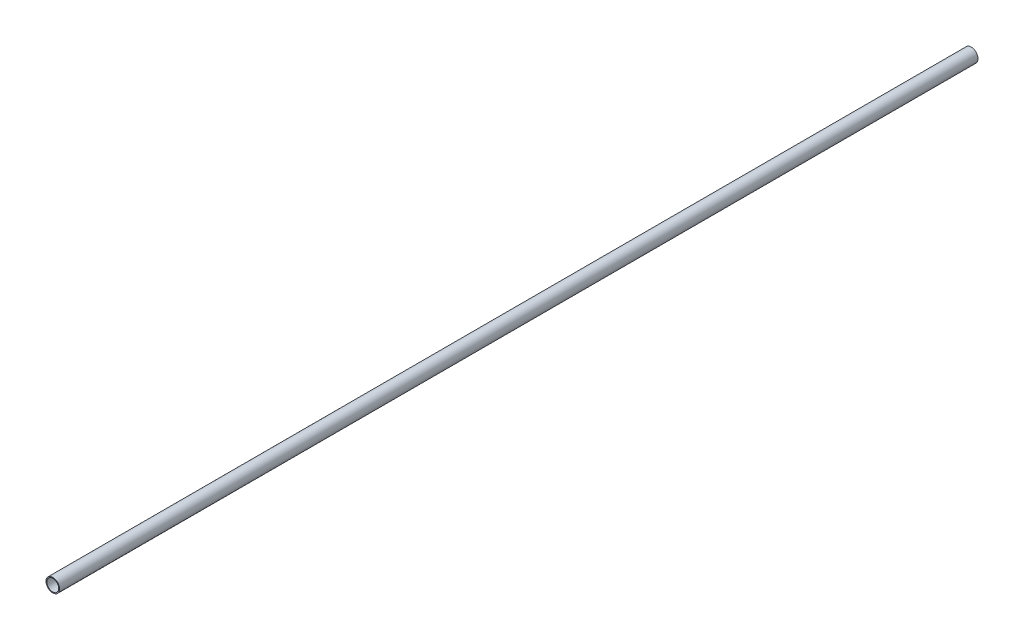
ISO-10303-21;
HEADER;
FILE_DESCRIPTION(('STEP AP214'),'2;1');
FILE_NAME('part.step','',(''),(''),'','','');
FILE_SCHEMA(('AUTOMOTIVE_DESIGN { 1 0 10303 214 1 1 1 1 }'));
ENDSEC;
DATA;
#1=APPLICATION_CONTEXT('core data for automotive mechanical design processes');
#2=APPLICATION_PROTOCOL_DEFINITION('international standard','automotive_design',2000,#1);
#3=PRODUCT_CONTEXT('',#1,'mechanical');
#4=PRODUCT('Part','Part','',(#3));
#5=PRODUCT_RELATED_PRODUCT_CATEGORY('part','',(#4));
#6=PRODUCT_DEFINITION_FORMATION('','',#4);
#7=PRODUCT_DEFINITION_CONTEXT('part definition',#1,'design');
#8=PRODUCT_DEFINITION('design','',#6,#7);
#9=PRODUCT_DEFINITION_SHAPE('','',#8);
#10=(LENGTH_UNIT() NAMED_UNIT(*) SI_UNIT(.MILLI.,.METRE.));
#11=(NAMED_UNIT(*) PLANE_ANGLE_UNIT() SI_UNIT($,.RADIAN.));
#12=(NAMED_UNIT(*) SI_UNIT($,.STERADIAN.) SOLID_ANGLE_UNIT());
#13=UNCERTAINTY_MEASURE_WITH_UNIT(LENGTH_MEASURE(1.E-05),#10,'distance_accuracy_value','');
#14=(GEOMETRIC_REPRESENTATION_CONTEXT(3) GLOBAL_UNCERTAINTY_ASSIGNED_CONTEXT((#13)) GLOBAL_UNIT_ASSIGNED_CONTEXT((#10,
#11,#12)) REPRESENTATION_CONTEXT('',''));
#15=CARTESIAN_POINT('',(0.,0.,0.));
#16=DIRECTION('',(0.,0.,1.));
#17=DIRECTION('',(1.,0.,0.));
#18=AXIS2_PLACEMENT_3D('',#15,#16,#17);
#19=CARTESIAN_POINT('',(0.,0.,1085.85));
#20=DIRECTION('',(0.,0.,1.));
#21=DIRECTION('',(1.,0.,0.));
#22=AXIS2_PLACEMENT_3D('',#19,#20,#21);
#23=PLANE('',#22);
#24=CARTESIAN_POINT('',(0.,0.,1085.85));
#25=DIRECTION('',(0.,0.,1.));
#26=DIRECTION('',(1.,0.,0.));
#27=AXIS2_PLACEMENT_3D('',#24,#25,#26);
#28=CIRCLE('',#27,8.0264);
#29=CARTESIAN_POINT('',(8.0264,0.,1085.85));
#30=VERTEX_POINT('',#29);
#31=EDGE_CURVE('E10',#30,#30,#28,.T.);
#32=ORIENTED_EDGE('',*,*,#31,.T.);
#33=EDGE_LOOP('',(#32));
#34=FACE_BOUND('',#33,.T.);
#35=CARTESIAN_POINT('',(0.,0.,1085.85));
#36=DIRECTION('',(0.,0.,1.));
#37=DIRECTION('',(1.,0.,0.));
#38=AXIS2_PLACEMENT_3D('',#35,#36,#37);
#39=CIRCLE('',#38,7.0104);
#40=CARTESIAN_POINT('',(7.0104,0.,1085.85));
#41=VERTEX_POINT('',#40);
#42=EDGE_CURVE('E48',#41,#41,#39,.T.);
#43=ORIENTED_EDGE('',*,*,#42,.F.);
#44=EDGE_LOOP('',(#43));
#45=FACE_BOUND('',#44,.T.);
#46=ADVANCED_FACE('F37',(#34,#45),#23,.T.);
#47=CARTESIAN_POINT('',(0.,0.,0.));
#48=DIRECTION('',(0.,0.,1.));
#49=DIRECTION('',(1.,0.,0.));
#50=AXIS2_PLACEMENT_3D('',#47,#48,#49);
#51=PLANE('',#50);
#52=CARTESIAN_POINT('',(0.,0.,0.));
#53=DIRECTION('',(0.,0.,1.));
#54=DIRECTION('',(1.,0.,0.));
#55=AXIS2_PLACEMENT_3D('',#52,#53,#54);
#56=CIRCLE('',#55,8.0264);
#57=CARTESIAN_POINT('',(8.0264,0.,0.));
#58=VERTEX_POINT('',#57);
#59=EDGE_CURVE('E41',#58,#58,#56,.T.);
#60=ORIENTED_EDGE('',*,*,#59,.F.);
#61=EDGE_LOOP('',(#60));
#62=FACE_BOUND('',#61,.T.);
#63=CARTESIAN_POINT('',(0.,0.,0.));
#64=DIRECTION('',(0.,0.,1.));
#65=DIRECTION('',(1.,0.,0.));
#66=AXIS2_PLACEMENT_3D('',#63,#64,#65);
#67=CIRCLE('',#66,7.0104);
#68=CARTESIAN_POINT('',(7.0104,0.,0.));
#69=VERTEX_POINT('',#68);
#70=EDGE_CURVE('E50',#69,#69,#67,.T.);
#71=ORIENTED_EDGE('',*,*,#70,.T.);
#72=EDGE_LOOP('',(#71));
#73=FACE_BOUND('',#72,.T.);
#74=ADVANCED_FACE('F60',(#62,#73),#51,.F.);
#75=CARTESIAN_POINT('',(0.,0.,1085.85));
#76=DIRECTION('',(0.,0.,-1.));
#77=DIRECTION('',(-1.,0.,0.));
#78=AXIS2_PLACEMENT_3D('',#75,#76,#77);
#79=CYLINDRICAL_SURFACE('',#78,8.0264);
#80=ORIENTED_EDGE('',*,*,#31,.F.);
#81=EDGE_LOOP('',(#80));
#82=FACE_BOUND('',#81,.T.);
#83=ORIENTED_EDGE('',*,*,#59,.T.);
#84=EDGE_LOOP('',(#83));
#85=FACE_BOUND('',#84,.T.);
#86=ADVANCED_FACE('F39',(#82,#85),#79,.T.);
#87=CARTESIAN_POINT('',(0.,0.,1085.85));
#88=DIRECTION('',(0.,0.,-1.));
#89=DIRECTION('',(-1.,0.,0.));
#90=AXIS2_PLACEMENT_3D('',#87,#88,#89);
#91=CYLINDRICAL_SURFACE('',#90,7.0104);
#92=ORIENTED_EDGE('',*,*,#42,.T.);
#93=EDGE_LOOP('',(#92));
#94=FACE_BOUND('',#93,.T.);
#95=ORIENTED_EDGE('',*,*,#70,.F.);
#96=EDGE_LOOP('',(#95));
#97=FACE_BOUND('',#96,.T.);
#98=ADVANCED_FACE('F56',(#94,#97),#91,.F.);
#99=CLOSED_SHELL('',(#46,#74,#86,#98));
#100=MANIFOLD_SOLID_BREP('B2',#99);
#101=ADVANCED_BREP_SHAPE_REPRESENTATION('',(#18,#100),#14);
#102=SHAPE_DEFINITION_REPRESENTATION(#9,#101);
ENDSEC;
END-ISO-10303-21;
